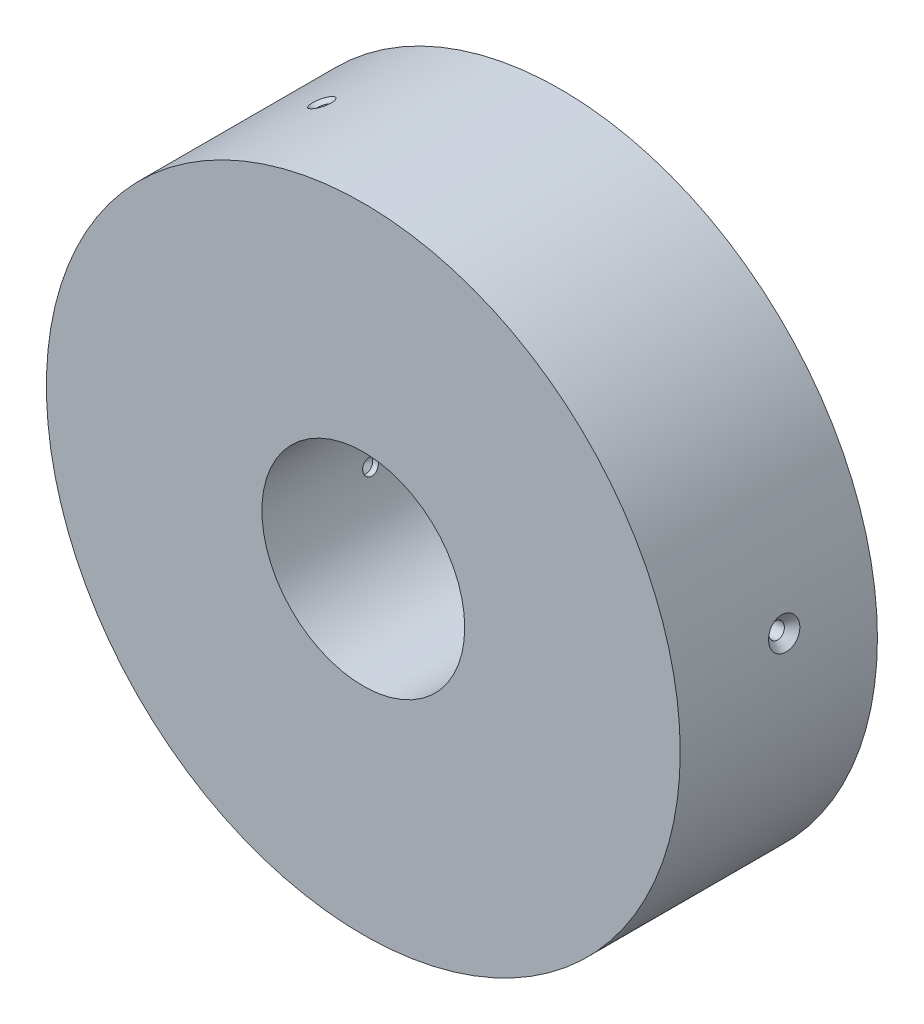
ISO-10303-21;
HEADER;
FILE_DESCRIPTION(('STEP AP214'),'2;1');
FILE_NAME('part.step','',(''),(''),'','','');
FILE_SCHEMA(('AUTOMOTIVE_DESIGN { 1 0 10303 214 1 1 1 1 }'));
ENDSEC;
DATA;
#1=APPLICATION_CONTEXT('core data for automotive mechanical design processes');
#2=APPLICATION_PROTOCOL_DEFINITION('international standard','automotive_design',2000,#1);
#3=PRODUCT_CONTEXT('',#1,'mechanical');
#4=PRODUCT('Part','Part','',(#3));
#5=PRODUCT_RELATED_PRODUCT_CATEGORY('part','',(#4));
#6=PRODUCT_DEFINITION_FORMATION('','',#4);
#7=PRODUCT_DEFINITION_CONTEXT('part definition',#1,'design');
#8=PRODUCT_DEFINITION('design','',#6,#7);
#9=PRODUCT_DEFINITION_SHAPE('','',#8);
#10=(LENGTH_UNIT() NAMED_UNIT(*) SI_UNIT(.MILLI.,.METRE.));
#11=(NAMED_UNIT(*) PLANE_ANGLE_UNIT() SI_UNIT($,.RADIAN.));
#12=(NAMED_UNIT(*) SI_UNIT($,.STERADIAN.) SOLID_ANGLE_UNIT());
#13=UNCERTAINTY_MEASURE_WITH_UNIT(LENGTH_MEASURE(1.E-05),#10,'distance_accuracy_value','');
#14=(GEOMETRIC_REPRESENTATION_CONTEXT(3) GLOBAL_UNCERTAINTY_ASSIGNED_CONTEXT((#13)) GLOBAL_UNIT_ASSIGNED_CONTEXT((#10,
#11,#12)) REPRESENTATION_CONTEXT('',''));
#15=CARTESIAN_POINT('',(0.,0.,0.));
#16=DIRECTION('',(0.,0.,1.));
#17=DIRECTION('',(1.,0.,0.));
#18=AXIS2_PLACEMENT_3D('',#15,#16,#17);
#19=CARTESIAN_POINT('',(0.,0.,28.));
#20=DIRECTION('',(0.,0.,1.));
#21=DIRECTION('',(1.,0.,0.));
#22=AXIS2_PLACEMENT_3D('',#19,#20,#21);
#23=PLANE('',#22);
#24=CARTESIAN_POINT('',(0.,0.,28.));
#25=DIRECTION('',(0.,0.,1.));
#26=DIRECTION('',(1.,0.,0.));
#27=AXIS2_PLACEMENT_3D('',#24,#25,#26);
#28=CIRCLE('',#27,45.);
#29=CARTESIAN_POINT('',(45.,0.,28.));
#30=VERTEX_POINT('',#29);
#31=EDGE_CURVE('E92',#30,#30,#28,.T.);
#32=ORIENTED_EDGE('',*,*,#31,.T.);
#33=EDGE_LOOP('',(#32));
#34=FACE_BOUND('',#33,.T.);
#35=CARTESIAN_POINT('',(0.,0.,28.));
#36=DIRECTION('',(0.,0.,1.));
#37=DIRECTION('',(1.,0.,0.));
#38=AXIS2_PLACEMENT_3D('',#35,#36,#37);
#39=CIRCLE('',#38,14.4);
#40=CARTESIAN_POINT('',(14.4,0.,28.));
#41=VERTEX_POINT('',#40);
#42=EDGE_CURVE('E84',#41,#41,#39,.T.);
#43=ORIENTED_EDGE('',*,*,#42,.F.);
#44=EDGE_LOOP('',(#43));
#45=FACE_BOUND('',#44,.T.);
#46=ADVANCED_FACE('F39',(#34,#45),#23,.T.);
#47=CARTESIAN_POINT('',(0.,0.,0.));
#48=DIRECTION('',(0.,0.,1.));
#49=DIRECTION('',(1.,0.,0.));
#50=AXIS2_PLACEMENT_3D('',#47,#48,#49);
#51=PLANE('',#50);
#52=CARTESIAN_POINT('',(0.,0.,0.));
#53=DIRECTION('',(0.,0.,1.));
#54=DIRECTION('',(1.,0.,0.));
#55=AXIS2_PLACEMENT_3D('',#52,#53,#54);
#56=CIRCLE('',#55,45.);
#57=CARTESIAN_POINT('',(45.,0.,0.));
#58=VERTEX_POINT('',#57);
#59=EDGE_CURVE('E87',#58,#58,#56,.T.);
#60=ORIENTED_EDGE('',*,*,#59,.F.);
#61=EDGE_LOOP('',(#60));
#62=FACE_BOUND('',#61,.T.);
#63=CARTESIAN_POINT('',(0.,0.,0.));
#64=DIRECTION('',(0.,0.,1.));
#65=DIRECTION('',(1.,0.,0.));
#66=AXIS2_PLACEMENT_3D('',#63,#64,#65);
#67=CIRCLE('',#66,14.4);
#68=CARTESIAN_POINT('',(14.4,0.,0.));
#69=VERTEX_POINT('',#68);
#70=EDGE_CURVE('E88',#69,#69,#67,.T.);
#71=ORIENTED_EDGE('',*,*,#70,.T.);
#72=EDGE_LOOP('',(#71));
#73=FACE_BOUND('',#72,.T.);
#74=ADVANCED_FACE('F154',(#62,#73),#51,.F.);
#75=CARTESIAN_POINT('',(0.,0.,28.));
#76=DIRECTION('',(0.,0.,-1.));
#77=DIRECTION('',(-1.,0.,0.));
#78=AXIS2_PLACEMENT_3D('',#75,#76,#77);
#79=CYLINDRICAL_SURFACE('',#78,45.);
#80=CARTESIAN_POINT('',(-21.0428952007584,39.7768344840298,13.0739573904661));
#81=CARTESIAN_POINT('',(-21.0073675603915,39.7956293992141,13.0150345494023));
#82=CARTESIAN_POINT('',(-20.9681229272539,39.8163300383292,12.9589547466294));
#83=CARTESIAN_POINT('',(-20.8828908983348,39.8610986461517,12.8536404169102));
#84=CARTESIAN_POINT('',(-20.836899827359,39.8851684499184,12.8044096497129));
#85=CARTESIAN_POINT('',(-20.730063216627,39.9408152958329,12.7056041034245));
#86=CARTESIAN_POINT('',(-20.6680389385008,39.9729604617733,12.6576099764715));
#87=CARTESIAN_POINT('',(-20.5374270759828,40.0402232677353,12.5742627283755));
#88=CARTESIAN_POINT('',(-20.4688374974114,40.0753418105299,12.5389134635943));
#89=CARTESIAN_POINT('',(-20.3283064002,40.1468063277951,12.4825201498933));
#90=CARTESIAN_POINT('',(-20.2564449054339,40.183119913672,12.4612357697937));
#91=CARTESIAN_POINT('',(-20.1103404843066,40.2564389942479,12.4326849027359));
#92=CARTESIAN_POINT('',(-20.0360979695121,40.2934443689126,12.4254160062924));
#93=CARTESIAN_POINT('',(-19.8883693594883,40.3665637493503,12.4251288745829));
#94=CARTESIAN_POINT('',(-19.8148861899611,40.40268307518,12.4319240962558));
#95=CARTESIAN_POINT('',(-19.6698005215668,40.4735156194476,12.4591710086627));
#96=CARTESIAN_POINT('',(-19.598198008119,40.5082288487878,12.479622593487));
#97=CARTESIAN_POINT('',(-19.4589553713568,40.5753007357521,12.5335189884272));
#98=CARTESIAN_POINT('',(-19.391312764069,40.6076608725789,12.5669555506034));
#99=CARTESIAN_POINT('',(-19.2618246235073,40.6692421817344,12.6457944677526));
#100=CARTESIAN_POINT('',(-19.1999793723322,40.698463201324,12.6911974045988));
#101=CARTESIAN_POINT('',(-19.0830644344662,40.7534155840515,12.7932348148328));
#102=CARTESIAN_POINT('',(-19.0280855650884,40.7791005566159,12.8499982706187));
#103=CARTESIAN_POINT('',(-18.9272681043464,40.8259919795383,12.9727403959067));
#104=CARTESIAN_POINT('',(-18.8814303400093,40.8471980246826,13.0387198982987));
#105=CARTESIAN_POINT('',(-18.7993377657576,40.8850460159915,13.1793331817781));
#106=CARTESIAN_POINT('',(-18.7632770299675,40.9015957462093,13.2541050914273));
#107=CARTESIAN_POINT('',(-18.7028346834685,40.9292692931129,13.4091691891359));
#108=CARTESIAN_POINT('',(-18.6784541668773,40.940392601493,13.4894618935378));
#109=CARTESIAN_POINT('',(-18.6416978552674,40.9571424854365,13.6547332622058));
#110=CARTESIAN_POINT('',(-18.6295301809202,40.9626737777795,13.7397679205013));
#111=CARTESIAN_POINT('',(-18.618243432441,40.9678050494296,13.9108777322749));
#112=CARTESIAN_POINT('',(-18.619125161714,40.9674046635444,13.9969529494904));
#113=CARTESIAN_POINT('',(-18.633978481263,40.9606507812134,14.1684662428191));
#114=CARTESIAN_POINT('',(-18.6480603304991,40.9542471402816,14.2538928350439));
#115=CARTESIAN_POINT('',(-18.6890964820229,40.9355368450566,14.4209263451237));
#116=CARTESIAN_POINT('',(-18.7160508615282,40.9232301553532,14.5025332400626));
#117=CARTESIAN_POINT('',(-18.7820034273548,40.8930024919445,14.6593283942231));
#118=CARTESIAN_POINT('',(-18.8209665558992,40.8750978584467,14.7345345344108));
#119=CARTESIAN_POINT('',(-18.9098837347493,40.8340383281084,14.8765525044979));
#120=CARTESIAN_POINT('',(-18.9598371140983,40.8108837517751,14.943364846449));
#121=CARTESIAN_POINT('',(-19.0685704466118,40.7601908966356,15.0657074930431));
#122=CARTESIAN_POINT('',(-19.1272226039917,40.732715787864,15.1213774934326));
#123=CARTESIAN_POINT('',(-19.252150358331,40.6738179242769,15.2208039730221));
#124=CARTESIAN_POINT('',(-19.3184251152312,40.642395604434,15.2645617632374));
#125=CARTESIAN_POINT('',(-19.4553169064987,40.5770413055386,15.3380406886814));
#126=CARTESIAN_POINT('',(-19.5258273321032,40.543168450801,15.3680130488721));
#127=CARTESIAN_POINT('',(-19.6702313929996,40.4733050618187,15.4141634243488));
#128=CARTESIAN_POINT('',(-19.7441246748539,40.4373147486925,15.4303428772547));
#129=CARTESIAN_POINT('',(-19.891908211763,40.364819497644,15.4482328115978));
#130=CARTESIAN_POINT('',(-19.9657795683864,40.328332028531,15.4501708328572));
#131=CARTESIAN_POINT('',(-20.1125534389851,40.255333955031,15.4401174178891));
#132=CARTESIAN_POINT('',(-20.1854559966416,40.2188233517655,15.4281266118558));
#133=CARTESIAN_POINT('',(-20.3278717205407,40.1470293307381,15.3906944596309));
#134=CARTESIAN_POINT('',(-20.3973998424207,40.1117407445499,15.3653198066324));
#135=CARTESIAN_POINT('',(-20.5315520562122,40.0432397400184,15.3019529873805));
#136=CARTESIAN_POINT('',(-20.5961759999023,40.0100273844312,15.2639604399568));
#137=CARTESIAN_POINT('',(-20.7193415768921,39.9463857906874,15.1761342425421));
#138=CARTESIAN_POINT('',(-20.7778266403223,39.9159827024001,15.12620237465));
#139=CARTESIAN_POINT('',(-20.8865828020978,39.8591825172315,15.0161572924099));
#140=CARTESIAN_POINT('',(-20.9368532128712,39.8327857556954,14.956043226662));
#141=CARTESIAN_POINT('',(-21.0287458256374,39.784351208719,14.8262256523563));
#142=CARTESIAN_POINT('',(-21.0702017365211,39.7623975620406,14.7563730607705));
#143=CARTESIAN_POINT('',(-21.1423328090851,39.7240913983127,14.6098973442908));
#144=CARTESIAN_POINT('',(-21.1730071466454,39.7077393094365,14.5332737023925));
#145=CARTESIAN_POINT('',(-21.2233110317766,39.6808757772779,14.3739378975498));
#146=CARTESIAN_POINT('',(-21.2427302442892,39.6704756053144,14.2911405328254));
#147=CARTESIAN_POINT('',(-21.2691934714466,39.6562937855512,14.1230265310221));
#148=CARTESIAN_POINT('',(-21.2762350520683,39.6525134395203,14.0377094017924));
#149=CARTESIAN_POINT('',(-21.277784387152,39.6516820962966,13.8659252772262));
#150=CARTESIAN_POINT('',(-21.2721437332613,39.6547107787755,13.7794565610967));
#151=CARTESIAN_POINT('',(-21.2481521282238,39.6675713358901,13.6088479464882));
#152=CARTESIAN_POINT('',(-21.2298082347879,39.6773994328799,13.5247067818412));
#153=CARTESIAN_POINT('',(-21.1858157418342,39.7009028900551,13.3776411467995));
#154=CARTESIAN_POINT('',(-21.1623800534905,39.7134059975382,13.31385456433));
#155=CARTESIAN_POINT('',(-21.1080824490219,39.7422923495488,13.1904809497549));
#156=CARTESIAN_POINT('',(-21.0772240129307,39.7586737757335,13.1308919665496));
#157=CARTESIAN_POINT('',(-21.0428952007584,39.7768344840298,13.0739573904661));
#158=B_SPLINE_CURVE_WITH_KNOTS('',3,(#80,#81,#82,#83,#84,#85,#86,#87,#88,#89,#90,#91,#92,#93,
#94,#95,#96,#97,#98,#99,#100,#101,#102,#103,#104,#105,#106,#107,#108,#109,#110,#111,#112,#113,
#114,#115,#116,#117,#118,#119,#120,#121,#122,#123,#124,#125,#126,#127,#128,#129,#130,#131,#132,
#133,#134,#135,#136,#137,#138,#139,#140,#141,#142,#143,#144,#145,#146,#147,#148,#149,#150,#151,
#152,#153,#154,#155,#156,#157),.UNSPECIFIED.,.T.,.F.,(4,2,2,2,2,2,2,2,2,2,2,2,2,2,2,2,2,2,2,2,2,
2,2,2,2,2,2,2,2,2,2,2,2,2,2,2,2,2,4),(0.,0.213800423053472,0.427717751716027,0.680720383458717,
0.933800108925164,1.1824351410236,1.43102742497892,1.67634358012602,1.92165783278667,
2.16681651825732,2.4119871269388,2.66011772557381,2.90827076326158,3.16103885695427,
3.41383062349065,3.67086062141034,3.92790644381228,4.18711865316305,4.44633241745436,
4.70479650047774,4.96324480860145,5.21821592794319,5.47315897471813,5.72325140525248,
5.97331776573463,6.21937986995408,6.46543084180264,6.71026713955823,6.95511083417499,
7.20204255700417,7.44899493760496,7.70025835592236,7.95154097609318,8.20737956629233,
8.46326846073602,8.72216734853946,8.98092251165874,9.18760526414537,9.39419130502986),.UNSPECIFIED.);
#159=CARTESIAN_POINT('',(-21.0428952007584,39.7768344840298,13.0739573904661));
#160=VERTEX_POINT('',#159);
#161=EDGE_CURVE('E11',#160,#160,#158,.T.);
#162=ORIENTED_EDGE('',*,*,#161,.T.);
#163=EDGE_LOOP('',(#162));
#164=FACE_BOUND('',#163,.T.);
#165=CARTESIAN_POINT('',(44.6683095181971,5.45363410563512,10.9446865556204));
#166=CARTESIAN_POINT('',(44.678919985219,5.36672831389895,11.0080949755624));
#167=CARTESIAN_POINT('',(44.6886989157546,5.28451710318225,11.0781314435854));
#168=CARTESIAN_POINT('',(44.7065565179975,5.13125487871574,11.2297675331237));
#169=CARTESIAN_POINT('',(44.7146336707229,5.06021384953215,11.3113773770877));
#170=CARTESIAN_POINT('',(44.7300177509489,4.92249143017027,11.495366302312));
#171=CARTESIAN_POINT('',(44.7370927252407,4.85754018025439,11.599066695091));
#172=CARTESIAN_POINT('',(44.749122178129,4.74544593277191,11.8157972811994));
#173=CARTESIAN_POINT('',(44.7540761343265,4.69830732272904,11.9288297648214));
#174=CARTESIAN_POINT('',(44.7619978801435,4.6222341886963,12.1634648641946));
#175=CARTESIAN_POINT('',(44.7649235608263,4.59368631779518,12.2851944143077));
#176=CARTESIAN_POINT('',(44.7686683996791,4.55704647604928,12.5317225481176));
#177=CARTESIAN_POINT('',(44.7694874636425,4.54895542002034,12.6565212688136));
#178=CARTESIAN_POINT('',(44.7690298260289,4.55345753563445,12.9073133979216));
#179=CARTESIAN_POINT('',(44.7677267302293,4.56631120707755,13.0333021770648));
#180=CARTESIAN_POINT('',(44.7629526520789,4.61287445176097,13.2813299609912));
#181=CARTESIAN_POINT('',(44.7594815965282,4.6465847292127,13.4033688322616));
#182=CARTESIAN_POINT('',(44.7503217197811,4.73398616396516,13.6399509641334));
#183=CARTESIAN_POINT('',(44.7446335110188,4.78767180337657,13.7544962844491));
#184=CARTESIAN_POINT('',(44.7309777732128,4.91361601475564,13.9727347157523));
#185=CARTESIAN_POINT('',(44.7230103666719,4.98587358849476,14.0764284095857));
#186=CARTESIAN_POINT('',(44.7048753267458,5.14592102351171,14.2684894004899));
#187=CARTESIAN_POINT('',(44.6947382816132,5.23349213238912,14.3570417577956));
#188=CARTESIAN_POINT('',(44.6722162420976,5.4223719421213,14.5176871572273));
#189=CARTESIAN_POINT('',(44.6598315296362,5.52367891970339,14.5897822610052));
#190=CARTESIAN_POINT('',(44.6332172894481,5.73471523488019,14.7137445726366));
#191=CARTESIAN_POINT('',(44.6190348898989,5.84420729241788,14.7660258031448));
#192=CARTESIAN_POINT('',(44.5888312992805,6.07034725163461,14.8508571323552));
#193=CARTESIAN_POINT('',(44.572810365889,6.18699414947031,14.8834099920594));
#194=CARTESIAN_POINT('',(44.5396384234174,6.42139502340531,14.9271999384894));
#195=CARTESIAN_POINT('',(44.5225194240693,6.5390702406662,14.9388836268894));
#196=CARTESIAN_POINT('',(44.4873002625024,6.77453180253228,14.9419232747287));
#197=CARTESIAN_POINT('',(44.4692001745258,6.89231813806783,14.9332807702247));
#198=CARTESIAN_POINT('',(44.4327580081589,7.12345270857752,14.8961440676452));
#199=CARTESIAN_POINT('',(44.4144200594689,7.23683319541193,14.8678459118957));
#200=CARTESIAN_POINT('',(44.3779490008403,7.45721990987268,14.7925201022161));
#201=CARTESIAN_POINT('',(44.3598158948298,7.5642260154333,14.7454920897525));
#202=CARTESIAN_POINT('',(44.3242842764993,7.76973555934499,14.6337691391622));
#203=CARTESIAN_POINT('',(44.3068920437518,7.86817172233027,14.5689485767198));
#204=CARTESIAN_POINT('',(44.2736520822218,8.05310970714816,14.4237608260943));
#205=CARTESIAN_POINT('',(44.2578044938973,8.13961044396159,14.3433922260719));
#206=CARTESIAN_POINT('',(44.2279853679666,8.30012786787362,14.1676910521538));
#207=CARTESIAN_POINT('',(44.2140577235526,8.37386006315275,14.0720911911054));
#208=CARTESIAN_POINT('',(44.1890434710385,8.50487505512671,13.8698851909573));
#209=CARTESIAN_POINT('',(44.1779571921221,8.56215594596454,13.763277778594));
#210=CARTESIAN_POINT('',(44.1588793506284,8.66001904714677,13.5394851598203));
#211=CARTESIAN_POINT('',(44.1509637070989,8.70019291536927,13.422114840865));
#212=CARTESIAN_POINT('',(44.1389438237131,8.76097051139951,13.1822239366686));
#213=CARTESIAN_POINT('',(44.1348399511339,8.78157235338081,13.0597028563229));
#214=CARTESIAN_POINT('',(44.1305929757169,8.80289097219691,12.8109020186797));
#215=CARTESIAN_POINT('',(44.1305139919548,8.80328583930182,12.684593476594));
#216=CARTESIAN_POINT('',(44.1344830335227,8.78336535155308,12.4336809592882));
#217=CARTESIAN_POINT('',(44.1385312441387,8.76304906689386,12.3090770608509));
#218=CARTESIAN_POINT('',(44.1505935063921,8.70207191017277,12.0646212239453));
#219=CARTESIAN_POINT('',(44.1586230653918,8.66133147908566,11.944789862058));
#220=CARTESIAN_POINT('',(44.1782863395452,8.56046972756208,11.7138915057035));
#221=CARTESIAN_POINT('',(44.1899199644735,8.50034889229962,11.6028242919189));
#222=CARTESIAN_POINT('',(44.2161343653791,8.3629117232996,11.3937809327906));
#223=CARTESIAN_POINT('',(44.2306864897891,8.28576187875346,11.2956918220479));
#224=CARTESIAN_POINT('',(44.2621551317115,8.115975278291,11.1144208277378));
#225=CARTESIAN_POINT('',(44.2790714006325,8.02334015046214,11.0312373789259));
#226=CARTESIAN_POINT('',(44.3141679834755,7.82714691584688,10.8839671023176));
#227=CARTESIAN_POINT('',(44.332315910075,7.72384688380111,10.819528860222));
#228=CARTESIAN_POINT('',(44.369426235607,7.5077301959708,10.7096484863998));
#229=CARTESIAN_POINT('',(44.3883884956879,7.3949151594473,10.6642031302765));
#230=CARTESIAN_POINT('',(44.425950039391,7.16576058766954,10.5946596416328));
#231=CARTESIAN_POINT('',(44.4445475419082,7.04956347306289,10.5700908662365));
#232=CARTESIAN_POINT('',(44.4811845880677,6.81456885271699,10.5413589357091));
#233=CARTESIAN_POINT('',(44.4992240980686,6.69577119092482,10.5371970085369));
#234=CARTESIAN_POINT('',(44.5339453618073,6.46077617008035,10.549330259494));
#235=CARTESIAN_POINT('',(44.5506427924107,6.34456587261612,10.5653349621477));
#236=CARTESIAN_POINT('',(44.5825421046523,6.11638714598839,10.616781410688));
#237=CARTESIAN_POINT('',(44.5977451647775,6.00441541776998,10.6522076929668));
#238=CARTESIAN_POINT('',(44.6224041064183,5.81784540054067,10.7289487813226));
#239=CARTESIAN_POINT('',(44.6322859561934,5.74148139615684,10.7659191624317));
#240=CARTESIAN_POINT('',(44.6510539841594,5.59365023519201,10.848782218011));
#241=CARTESIAN_POINT('',(44.6599404175078,5.52218182554495,10.8946725977095));
#242=CARTESIAN_POINT('',(44.6683095181971,5.45363410563512,10.9446865556204));
#243=B_SPLINE_CURVE_WITH_KNOTS('',3,(#165,#166,#167,#168,#169,#170,#171,#172,#173,#174,#175,
#176,#177,#178,#179,#180,#181,#182,#183,#184,#185,#186,#187,#188,#189,#190,#191,#192,#193,#194,
#195,#196,#197,#198,#199,#200,#201,#202,#203,#204,#205,#206,#207,#208,#209,#210,#211,#212,#213,
#214,#215,#216,#217,#218,#219,#220,#221,#222,#223,#224,#225,#226,#227,#228,#229,#230,#231,#232,
#233,#234,#235,#236,#237,#238,#239,#240,#241,#242),.UNSPECIFIED.,.T.,.F.,(4,2,2,2,2,2,2,2,2,2,2,
2,2,2,2,2,2,2,2,2,2,2,2,2,2,2,2,2,2,2,2,2,2,2,2,2,2,2,4),(0.,0.324054949497402,0.64839793162072,
1.01437421662824,1.38044058848348,1.75389596870395,2.12736804931785,2.5055207386365,
2.88368619676201,3.26174726990263,3.63978802677149,4.0128140264795,4.38579327037297,
4.75048153679936,5.11511875300335,5.4718547325642,5.82856375434584,6.18176516728002,
6.53497334164413,6.89074250432336,7.24654398779291,7.6094661987063,7.97243043662712,
8.34362955803142,8.71486444201497,9.0920115184788,9.46917552731318,9.84782026933397,
10.2264555330012,10.6015411461344,10.9765873483939,11.3440670368536,11.7114843134128,
12.0703804158724,12.4292981142289,12.7831046438247,13.136629878269,13.392296802164,
13.6478980396624),.UNSPECIFIED.);
#244=CARTESIAN_POINT('',(44.6683095181971,5.45363410563512,10.9446865556204));
#245=VERTEX_POINT('',#244);
#246=EDGE_CURVE('E54',#245,#245,#243,.T.);
#247=ORIENTED_EDGE('',*,*,#246,.T.);
#248=EDGE_LOOP('',(#247));
#249=FACE_BOUND('',#248,.T.);
#250=ORIENTED_EDGE('',*,*,#31,.F.);
#251=EDGE_LOOP('',(#250));
#252=FACE_BOUND('',#251,.T.);
#253=ORIENTED_EDGE('',*,*,#59,.T.);
#254=EDGE_LOOP('',(#253));
#255=FACE_BOUND('',#254,.T.);
#256=ADVANCED_FACE('F41',(#164,#249,#252,#255),#79,.T.);
#257=CARTESIAN_POINT('',(0.,0.,28.));
#258=DIRECTION('',(0.,0.,-1.));
#259=DIRECTION('',(-1.,0.,0.));
#260=AXIS2_PLACEMENT_3D('',#257,#258,#259);
#261=CYLINDRICAL_SURFACE('',#260,14.4);
#262=CARTESIAN_POINT('',(5.57808165500605,-13.2757299253218,13.9365692920702));
#263=CARTESIAN_POINT('',(5.57808378573651,-13.2757292809626,13.9864537349427));
#264=CARTESIAN_POINT('',(5.58197387015151,-13.27409660665,14.0363731372226));
#265=CARTESIAN_POINT('',(5.59742680891836,-13.2675875990363,14.134833630108));
#266=CARTESIAN_POINT('',(5.60899860145459,-13.2627074871067,14.1833730463144));
#267=CARTESIAN_POINT('',(5.63945281558359,-13.2497865623058,14.2776330963139));
#268=CARTESIAN_POINT('',(5.65833138714674,-13.2417474139347,14.3233551999));
#269=CARTESIAN_POINT('',(5.70281341091032,-13.2226511033036,14.410699815769));
#270=CARTESIAN_POINT('',(5.72841532002875,-13.2115946335302,14.4523232657291));
#271=CARTESIAN_POINT('',(5.78560453938405,-13.1866505102511,14.5303622074199));
#272=CARTESIAN_POINT('',(5.81719956317269,-13.1727592063513,14.5667708801983));
#273=CARTESIAN_POINT('',(5.8854033203209,-13.1424281529159,14.6332884174145));
#274=CARTESIAN_POINT('',(5.92201226239491,-13.125988297288,14.6633970194673));
#275=CARTESIAN_POINT('',(5.99918321489135,-13.0908974519603,14.7164804403669));
#276=CARTESIAN_POINT('',(6.03974829585345,-13.0722447422942,14.7394496591834));
#277=CARTESIAN_POINT('',(6.12360957195899,-13.0331708908664,14.7775664360334));
#278=CARTESIAN_POINT('',(6.16690573844259,-13.0127497676616,14.7927140761307));
#279=CARTESIAN_POINT('',(6.2549074710164,-12.9706787319903,14.8147389043864));
#280=CARTESIAN_POINT('',(6.29961115136512,-12.9490304349099,14.8216267122285));
#281=CARTESIAN_POINT('',(6.3891928554852,-12.905065040967,14.8269691497471));
#282=CARTESIAN_POINT('',(6.43407087732595,-12.8827479514922,14.8254238725442));
#283=CARTESIAN_POINT('',(6.52266670366456,-12.8381181159596,14.8139527693505));
#284=CARTESIAN_POINT('',(6.56638600602329,-12.8158054054339,14.8040383677683));
#285=CARTESIAN_POINT('',(6.65151160004669,-12.771831900026,14.7761281764498));
#286=CARTESIAN_POINT('',(6.6929178783026,-12.7501711089234,14.7581323398703));
#287=CARTESIAN_POINT('',(6.7723135385823,-12.7081780695663,14.7145571721511));
#288=CARTESIAN_POINT('',(6.81030056385318,-12.6878467402568,14.6889726618337));
#289=CARTESIAN_POINT('',(6.8818059959802,-12.6492055341383,14.630950166542));
#290=CARTESIAN_POINT('',(6.91532435380669,-12.6308956795092,14.5985121063816));
#291=CARTESIAN_POINT('',(6.97705701226134,-12.5969012911564,14.5276387820128));
#292=CARTESIAN_POINT('',(7.00526237003939,-12.5812211886139,14.489193602079));
#293=CARTESIAN_POINT('',(7.05555829132307,-12.5530844976678,14.4074321025557));
#294=CARTESIAN_POINT('',(7.07764885245776,-12.540627910514,14.3641157810775));
#295=CARTESIAN_POINT('',(7.11513868567546,-12.5193956708331,14.273835268541));
#296=CARTESIAN_POINT('',(7.13053759174852,-12.5106202196519,14.2268708781119));
#297=CARTESIAN_POINT('',(7.15423985760261,-12.4970812586171,14.130630271159));
#298=CARTESIAN_POINT('',(7.16254329881656,-12.4923177027198,14.081354081174));
#299=CARTESIAN_POINT('',(7.17183016767697,-12.4869884790206,13.981975696368));
#300=CARTESIAN_POINT('',(7.17282565142746,-12.4864158972776,13.9318749987025));
#301=CARTESIAN_POINT('',(7.16750252579795,-12.4894722305464,13.8321932537999));
#302=CARTESIAN_POINT('',(7.16118395353792,-12.493101124235,13.7826122039269));
#303=CARTESIAN_POINT('',(7.14140523807917,-12.5044176009924,13.6854163899361));
#304=CARTESIAN_POINT('',(7.12795065609606,-12.5121020234945,13.6378001257288));
#305=CARTESIAN_POINT('',(7.09425312378059,-12.5312388009009,13.5458392400499));
#306=CARTESIAN_POINT('',(7.07401011338159,-12.5426911891455,13.5014946475317));
#307=CARTESIAN_POINT('',(7.02723141119685,-12.5689592436635,13.4172721597145));
#308=CARTESIAN_POINT('',(7.00068751607378,-12.583779293327,13.3774001879695));
#309=CARTESIAN_POINT('',(6.94201577635635,-12.6162410420052,13.3033144270551));
#310=CARTESIAN_POINT('',(6.90988787836752,-12.6338827680007,13.2691006919962));
#311=CARTESIAN_POINT('',(6.84084934683661,-12.6713978223864,13.2072557675287));
#312=CARTESIAN_POINT('',(6.80393229628847,-12.6912741400617,13.1796335537291));
#313=CARTESIAN_POINT('',(6.72634040956143,-12.7325674364233,13.1318171813846));
#314=CARTESIAN_POINT('',(6.68566559610497,-12.7539844057934,13.1116229779276));
#315=CARTESIAN_POINT('',(6.60169889307884,-12.7976485153203,13.0792514829723));
#316=CARTESIAN_POINT('',(6.55840888313539,-12.8198950549385,13.0670685066661));
#317=CARTESIAN_POINT('',(6.47038925730785,-12.8645441839413,13.0510466908708));
#318=CARTESIAN_POINT('',(6.42565965518351,-12.8869467718329,13.0472077716524));
#319=CARTESIAN_POINT('',(6.33610127233114,-12.9312146273724,13.0479838149953));
#320=CARTESIAN_POINT('',(6.2912727802651,-12.9530807266749,13.0525847285108));
#321=CARTESIAN_POINT('',(6.20272608486554,-12.9957148592135,13.0700807116125));
#322=CARTESIAN_POINT('',(6.15900788349486,-13.0164828905084,13.0829757958605));
#323=CARTESIAN_POINT('',(6.07394979965289,-13.0563908736606,13.1166909261259));
#324=CARTESIAN_POINT('',(6.03260990302935,-13.0755308352063,13.1375109249799));
#325=CARTESIAN_POINT('',(5.95352032347102,-13.1117309955871,13.1864828976383));
#326=CARTESIAN_POINT('',(5.91577054629778,-13.1287912490167,13.2146346789153));
#327=CARTESIAN_POINT('',(5.8449219273615,-13.1604862715342,13.2775229063043));
#328=CARTESIAN_POINT('',(5.81183038132069,-13.1751172421725,13.3122694856681));
#329=CARTESIAN_POINT('',(5.7513534300773,-13.2016297169513,13.3873478123358));
#330=CARTESIAN_POINT('',(5.72396942383897,-13.2135105470888,13.4276809249213));
#331=CARTESIAN_POINT('',(5.67572103501612,-13.2343070840311,13.5128325388798));
#332=CARTESIAN_POINT('',(5.65486466034574,-13.2432191496945,13.5576564611971));
#333=CARTESIAN_POINT('',(5.62037885530093,-13.2578918397634,13.6504453633015));
#334=CARTESIAN_POINT('',(5.60674095570135,-13.2636561575821,13.6984065875843));
#335=CARTESIAN_POINT('',(5.59066011592844,-13.2704394169435,13.7783128385932));
#336=CARTESIAN_POINT('',(5.58594972940653,-13.272421687292,13.8097412765341));
#337=CARTESIAN_POINT('',(5.57965982172439,-13.275067146029,13.8729648357134));
#338=CARTESIAN_POINT('',(5.57808029632353,-13.2757303362042,13.9047599564549));
#339=CARTESIAN_POINT('',(5.57808165500605,-13.2757299253218,13.9365692920702));
#340=B_SPLINE_CURVE_WITH_KNOTS('',3,(#262,#263,#264,#265,#266,#267,#268,#269,#270,#271,#272,
#273,#274,#275,#276,#277,#278,#279,#280,#281,#282,#283,#284,#285,#286,#287,#288,#289,#290,#291,
#292,#293,#294,#295,#296,#297,#298,#299,#300,#301,#302,#303,#304,#305,#306,#307,#308,#309,#310,
#311,#312,#313,#314,#315,#316,#317,#318,#319,#320,#321,#322,#323,#324,#325,#326,#327,#328,#329,
#330,#331,#332,#333,#334,#335,#336,#337,#338,#339),.UNSPECIFIED.,.T.,.F.,(4,2,2,2,2,2,2,2,2,2,2,
2,2,2,2,2,2,2,2,2,2,2,2,2,2,2,2,2,2,2,2,2,2,2,2,2,2,2,4),(0.,0.14953720520358,0.299248712708336,
0.448881442579441,0.598479860015463,0.748272143688428,0.898070664662723,1.04798639065869,
1.1979005437104,1.34762174445644,1.49734129193931,1.64685679221715,1.79637315915641,
1.94599180492014,2.09561209214571,2.24548201306234,2.39535199208898,2.54523016744353,
2.69510662265945,2.84473576758919,2.99436415313116,3.14387610165898,3.29338937316166,
3.44309837918411,3.59280881680932,3.7427219650045,3.89263420676443,4.04243995489982,
4.19224427160268,4.34179944851571,4.49135488980329,4.6409094410598,4.79046006551578,
4.94024237043798,5.09006134515398,5.24006339961068,5.38988906873465,5.48524315742686,
5.58059711696561),.UNSPECIFIED.);
#341=CARTESIAN_POINT('',(5.57808165500605,-13.2757299253218,13.9365692920702));
#342=VERTEX_POINT('',#341);
#343=EDGE_CURVE('E44',#342,#342,#340,.T.);
#344=ORIENTED_EDGE('',*,*,#343,.F.);
#345=EDGE_LOOP('',(#344));
#346=FACE_BOUND('',#345,.T.);
#347=CARTESIAN_POINT('',(-7.17161878459045,12.4871087129291,13.9365692920702));
#348=CARTESIAN_POINT('',(-7.17161697992164,12.4871100161488,13.8866848491976));
#349=CARTESIAN_POINT('',(-7.16795943227388,12.4892125687334,13.8367654469178));
#350=CARTESIAN_POINT('',(-7.15341162758659,12.4975505466315,13.7383049540324));
#351=CARTESIAN_POINT('',(-7.14251294498641,12.5037907864127,13.6897655378259));
#352=CARTESIAN_POINT('',(-7.11376847860637,12.5201665339819,13.5955054878264));
#353=CARTESIAN_POINT('',(-7.09592635338276,12.5302999903667,13.5497833842403));
#354=CARTESIAN_POINT('',(-7.05376372415615,12.5540830140291,13.4624387683713));
#355=CARTESIAN_POINT('',(-7.02944470665505,12.5677317744907,13.4208153184112));
#356=CARTESIAN_POINT('',(-6.97492535513562,12.5980707989729,13.3427763767204));
#357=CARTESIAN_POINT('',(-6.94471744029544,12.6147649815899,13.306367703942));
#358=CARTESIAN_POINT('',(-6.87923445373255,12.6505937934937,13.2398501667258));
#359=CARTESIAN_POINT('',(-6.84395917106748,12.6697285243709,13.2097415646731));
#360=CARTESIAN_POINT('',(-6.76925294870274,12.7097997568827,13.1566581437734));
#361=CARTESIAN_POINT('',(-6.72981877913799,12.7307376565407,13.133688924957));
#362=CARTESIAN_POINT('',(-6.64788791633024,12.7737122212858,13.0955721481069));
#363=CARTESIAN_POINT('',(-6.60539125522416,12.795748874842,13.0804245080096));
#364=CARTESIAN_POINT('',(-6.51856612441908,12.8401974253147,13.058399679754));
#365=CARTESIAN_POINT('',(-6.47424008281351,12.8626088027553,13.0515118719118));
#366=CARTESIAN_POINT('',(-6.38495052123511,12.9071645181098,13.0461694343932));
#367=CARTESIAN_POINT('',(-6.33998700830691,12.9293088589696,13.0477147115961));
#368=CARTESIAN_POINT('',(-6.25076715098528,12.9726777386393,13.0591858147898));
#369=CARTESIAN_POINT('',(-6.20650992633316,12.9939034898823,13.069100216372));
#370=CARTESIAN_POINT('',(-6.11991671339286,13.0349114331173,13.0970104076905));
#371=CARTESIAN_POINT('',(-6.07758073624254,13.0546936167411,13.11500624427));
#372=CARTESIAN_POINT('',(-5.99603752201721,13.0923471748664,13.1585814119892));
#373=CARTESIAN_POINT('',(-5.95683244501278,13.1102172329945,13.1841659223066));
#374=CARTESIAN_POINT('',(-5.88273984120163,13.1436306389035,13.2421884175983));
#375=CARTESIAN_POINT('',(-5.84785236176734,13.1591739611561,13.2746264777587));
#376=CARTESIAN_POINT('',(-5.78338178655419,13.1876359444153,13.3454998021275));
#377=CARTESIAN_POINT('',(-5.75380763798136,13.2005501830426,13.3839449820613));
#378=CARTESIAN_POINT('',(-5.70093106336387,13.2234722451638,13.4657064815846));
#379=CARTESIAN_POINT('',(-5.677628639751,13.233480067531,13.5090228030628));
#380=CARTESIAN_POINT('',(-5.63800885513718,13.2504083947878,13.5993033155993));
#381=CARTESIAN_POINT('',(-5.62169187621615,13.2573287308035,13.6462677060284));
#382=CARTESIAN_POINT('',(-5.59655134664835,13.2679614466171,13.7425083129813));
#383=CARTESIAN_POINT('',(-5.58772771000231,13.2716738632315,13.7917845029663));
#384=CARTESIAN_POINT('',(-5.57785785068641,13.2758250601132,13.8911628877723));
#385=CARTESIAN_POINT('',(-5.57679881857507,13.2762692320811,13.9412635854379));
#386=CARTESIAN_POINT('',(-5.58245744644413,13.2738908355294,14.0409453303404));
#387=CARTESIAN_POINT('',(-5.5891750669568,13.2710682835889,14.0905263802134));
#388=CARTESIAN_POINT('',(-5.6101688191975,13.2622069858141,14.1877221942042));
#389=CARTESIAN_POINT('',(-5.62443906501595,13.2561707444495,14.2353384584115));
#390=CARTESIAN_POINT('',(-5.66009266950387,13.2409865282804,14.3272993440904));
#391=CARTESIAN_POINT('',(-5.68147609111349,13.2318385259418,14.3716439366087));
#392=CARTESIAN_POINT('',(-5.73073367202627,13.2105794481427,14.4558664244258));
#393=CARTESIAN_POINT('',(-5.75861629199666,13.1984645092688,14.4957383961708));
#394=CARTESIAN_POINT('',(-5.82001177263592,13.1715065211059,14.5698241570852));
#395=CARTESIAN_POINT('',(-5.85352468714182,13.1566634457303,14.6040378921442));
#396=CARTESIAN_POINT('',(-5.92522567086749,13.1245283080416,14.6658828166117));
#397=CARTESIAN_POINT('',(-5.96342000888776,13.1072329569698,14.6935050304112));
#398=CARTESIAN_POINT('',(-6.04331283278028,13.0705890775252,14.7413214027557));
#399=CARTESIAN_POINT('',(-6.08501129746364,13.0512405615674,14.7615156062128));
#400=CARTESIAN_POINT('',(-6.17065561288807,13.0109663401183,14.793887101168));
#401=CARTESIAN_POINT('',(-6.21459984610423,12.9900417647838,14.8060700774742));
#402=CARTESIAN_POINT('',(-6.30348555559984,12.947142698372,14.8220918932695));
#403=CARTESIAN_POINT('',(-6.34842702234637,12.925168217329,14.8259308124879));
#404=CARTESIAN_POINT('',(-6.43794291227975,12.8808144979513,14.825154769145));
#405=CARTESIAN_POINT('',(-6.48251782159341,12.8584359935486,14.8205538556295));
#406=CARTESIAN_POINT('',(-6.57012118569564,12.813895707049,14.8030578725278));
#407=CARTESIAN_POINT('',(-6.61314963775035,12.7917339253352,14.7901627882798));
#408=CARTESIAN_POINT('',(-6.69646958980547,12.7483137648601,14.7564476580145));
#409=CARTESIAN_POINT('',(-6.73676110609244,12.7270553807233,14.7356276591604));
#410=CARTESIAN_POINT('',(-6.81351301402119,12.6861315754798,14.686655686502));
#411=CARTESIAN_POINT('',(-6.84997350622766,12.666466112562,14.658503905225));
#412=CARTESIAN_POINT('',(-6.9181451308566,12.6293617886493,14.595615677836));
#413=CARTESIAN_POINT('',(-6.94984881817424,12.6119264242524,14.5608690984722));
#414=CARTESIAN_POINT('',(-7.00760922780177,12.5799247363242,14.4857907718045));
#415=CARTESIAN_POINT('',(-7.03366456571806,12.5653591162383,14.445457659219));
#416=CARTESIAN_POINT('',(-7.07946340971684,12.5396128764902,14.3603060452605));
#417=CARTESIAN_POINT('',(-7.09919916379222,12.5284364150709,14.3154821229432));
#418=CARTESIAN_POINT('',(-7.13178169066245,12.5099178426044,14.2226932208388));
#419=CARTESIAN_POINT('',(-7.14463653682594,12.5025712382516,14.174731996556));
#420=CARTESIAN_POINT('',(-7.15978323219294,12.493900388534,14.0948257455471));
#421=CARTESIAN_POINT('',(-7.16421627184172,12.4913576938232,14.0633973076062));
#422=CARTESIAN_POINT('',(-7.17013462142713,12.4879614416588,14.000173748427));
#423=CARTESIAN_POINT('',(-7.17161993535635,12.4871078819174,13.9683786276854));
#424=CARTESIAN_POINT('',(-7.17161878459045,12.4871087129291,13.9365692920702));
#425=B_SPLINE_CURVE_WITH_KNOTS('',3,(#347,#348,#349,#350,#351,#352,#353,#354,#355,#356,#357,
#358,#359,#360,#361,#362,#363,#364,#365,#366,#367,#368,#369,#370,#371,#372,#373,#374,#375,#376,
#377,#378,#379,#380,#381,#382,#383,#384,#385,#386,#387,#388,#389,#390,#391,#392,#393,#394,#395,
#396,#397,#398,#399,#400,#401,#402,#403,#404,#405,#406,#407,#408,#409,#410,#411,#412,#413,#414,
#415,#416,#417,#418,#419,#420,#421,#422,#423,#424),.UNSPECIFIED.,.T.,.F.,(4,2,2,2,2,2,2,2,2,2,2,
2,2,2,2,2,2,2,2,2,2,2,2,2,2,2,2,2,2,2,2,2,2,2,2,2,2,2,4),(0.,0.149537205203579,
0.299248712708335,0.44888144257944,0.598479860015463,0.748272143688422,0.898070664662716,
1.04798639065869,1.1979005437104,1.34762174445644,1.49734129193931,1.64685679221715,
1.79637315915641,1.94599180492014,2.0956120921457,2.24548201306234,2.39535199208898,
2.54523016744353,2.69510662265945,2.84473576758918,2.99436415313115,3.14387610165898,
3.29338937316166,3.44309837918411,3.59280881680932,3.7427219650045,3.89263420676443,
4.04243995489981,4.19224427160267,4.34179944851571,4.49135488980329,4.6409094410598,
4.79046006551578,4.94024237043798,5.09006134515397,5.24006339961067,5.38988906873465,
5.48524315742686,5.58059711696561),.UNSPECIFIED.);
#426=CARTESIAN_POINT('',(-7.17161878459045,12.4871087129291,13.9365692920702));
#427=VERTEX_POINT('',#426);
#428=EDGE_CURVE('E70',#427,#427,#425,.T.);
#429=ORIENTED_EDGE('',*,*,#428,.F.);
#430=EDGE_LOOP('',(#429));
#431=FACE_BOUND('',#430,.T.);
#432=CARTESIAN_POINT('',(-14.3620611628125,-1.04460478442023,12.7405745471577));
#433=CARTESIAN_POINT('',(-14.3620613147407,-1.04460753992737,12.8022652420436));
#434=CARTESIAN_POINT('',(-14.3616852314089,-1.04981382151018,12.8639983726357));
#435=CARTESIAN_POINT('',(-14.3601577039238,-1.07050182134588,12.985757826979));
#436=CARTESIAN_POINT('',(-14.3590053724603,-1.0859952983487,13.0457821154667));
#437=CARTESIAN_POINT('',(-14.3558612632288,-1.12679346183536,13.1623426978032));
#438=CARTESIAN_POINT('',(-14.353869949336,-1.15209272606064,13.2188808993446));
#439=CARTESIAN_POINT('',(-14.3489563091129,-1.21175261145402,13.3268917645085));
#440=CARTESIAN_POINT('',(-14.3460341869464,-1.24611124525209,13.3783655357274));
#441=CARTESIAN_POINT('',(-14.3391506907539,-1.32296806856335,13.4749124718182));
#442=CARTESIAN_POINT('',(-14.3351873227532,-1.3654818324501,13.5199730975433));
#443=CARTESIAN_POINT('',(-14.3261360340047,-1.45737902888069,13.6023070350926));
#444=CARTESIAN_POINT('',(-14.3210480649667,-1.50676275638553,13.6395800123831));
#445=CARTESIAN_POINT('',(-14.3096922375075,-1.6110425175416,13.7053214126485));
#446=CARTESIAN_POINT('',(-14.3034229583555,-1.66594515115434,13.733779123626));
#447=CARTESIAN_POINT('',(-14.2897229594151,-1.77963267062552,13.7810136497161));
#448=CARTESIAN_POINT('',(-14.2822922570703,-1.83841749816905,13.7997906102072));
#449=CARTESIAN_POINT('',(-14.2663811433932,-1.95806075086004,13.8270949087086));
#450=CARTESIAN_POINT('',(-14.2579028273813,-2.01891486596733,13.8356423519848));
#451=CARTESIAN_POINT('',(-14.2400721080626,-2.14106404970599,13.8423071153246));
#452=CARTESIAN_POINT('',(-14.2307197186789,-2.20235911129919,13.8404246014987));
#453=CARTESIAN_POINT('',(-14.211439852582,-2.32351748159222,13.8262993795781));
#454=CARTESIAN_POINT('',(-14.2015136163351,-2.3833835104742,13.8140782933739));
#455=CARTESIAN_POINT('',(-14.1814261747265,-2.50013251975082,13.7796564346442));
#456=CARTESIAN_POINT('',(-14.1712649674347,-2.55701547563111,13.7574555801212));
#457=CARTESIAN_POINT('',(-14.1511161702174,-2.66627148799267,13.7036801461257));
#458=CARTESIAN_POINT('',(-14.1411287718621,-2.71863979222712,13.6720958411314));
#459=CARTESIAN_POINT('',(-14.121793234357,-2.81735512036892,13.60045713334));
#460=CARTESIAN_POINT('',(-14.1124451060725,-2.86370204194621,13.5604025866262));
#461=CARTESIAN_POINT('',(-14.094823928556,-2.94921234272802,13.4728384416767));
#462=CARTESIAN_POINT('',(-14.0865536862656,-2.9883570714431,13.4253100631388));
#463=CARTESIAN_POINT('',(-14.0715478816682,-3.05823834197696,13.3242129850191));
#464=CARTESIAN_POINT('',(-14.0648123203528,-3.08897487836234,13.270644281534));
#465=CARTESIAN_POINT('',(-14.0532425964982,-3.1411926710432,13.1589743859885));
#466=CARTESIAN_POINT('',(-14.0484086176389,-3.16267303327434,13.1008727567275));
#467=CARTESIAN_POINT('',(-14.0409155677524,-3.19577542635952,12.9817923175853));
#468=CARTESIAN_POINT('',(-14.0382564583856,-3.20739763099749,12.9208135584434));
#469=CARTESIAN_POINT('',(-14.0352698224331,-3.22044198708432,12.797874669382));
#470=CARTESIAN_POINT('',(-14.0349364249965,-3.22188982200858,12.7359174065117));
#471=CARTESIAN_POINT('',(-14.0366048851793,-3.2146129922255,12.6126353933673));
#472=CARTESIAN_POINT('',(-14.0386067245428,-3.20588840704143,12.5513106381523));
#473=CARTESIAN_POINT('',(-14.0448267805726,-3.17852719419279,12.4311094291096));
#474=CARTESIAN_POINT('',(-14.0490423279834,-3.15990250359435,12.3722301186665));
#475=CARTESIAN_POINT('',(-14.0594506530607,-3.11326434731822,12.2585027923));
#476=CARTESIAN_POINT('',(-14.0656434574525,-3.08525075473667,12.203654830878));
#477=CARTESIAN_POINT('',(-14.0796815067101,-3.02054015631429,12.0994267505309));
#478=CARTESIAN_POINT('',(-14.0875300299848,-2.98382590465837,12.0500577807395));
#479=CARTESIAN_POINT('',(-14.1044581944671,-2.90275204480582,11.9583016342922));
#480=CARTESIAN_POINT('',(-14.1135378535123,-2.85839232583469,11.9159145588136));
#481=CARTESIAN_POINT('',(-14.1324939296526,-2.76314558614645,11.8392360831473));
#482=CARTESIAN_POINT('',(-14.1423719666673,-2.71224516430456,11.8049617265475));
#483=CARTESIAN_POINT('',(-14.1624447373306,-2.60540011856611,11.7455984362631));
#484=CARTESIAN_POINT('',(-14.172639468251,-2.54945553811575,11.7205094234731));
#485=CARTESIAN_POINT('',(-14.1928975160669,-2.43414874005028,11.6802584148034));
#486=CARTESIAN_POINT('',(-14.2029609623054,-2.3747902563306,11.6650857895336));
#487=CARTESIAN_POINT('',(-14.2225863274307,-2.25427674245025,11.6450634938938));
#488=CARTESIAN_POINT('',(-14.2321482541421,-2.19312174034166,11.6402136624233));
#489=CARTESIAN_POINT('',(-14.2504430771071,-2.07091286088741,11.6409763741592));
#490=CARTESIAN_POINT('',(-14.2591780217373,-2.0098591223967,11.646562316324));
#491=CARTESIAN_POINT('',(-14.2756339576883,-1.88943636512378,11.6679826531866));
#492=CARTESIAN_POINT('',(-14.2833549474636,-1.83006734890964,11.6838170635056));
#493=CARTESIAN_POINT('',(-14.2976622223892,-1.71471156328885,11.7252783446577));
#494=CARTESIAN_POINT('',(-14.304248548796,-1.65872467095541,11.7509048593385));
#495=CARTESIAN_POINT('',(-14.3162507277857,-1.5517303062921,11.8112196998035));
#496=CARTESIAN_POINT('',(-14.3216666031721,-1.50072273696281,11.8459078490147));
#497=CARTESIAN_POINT('',(-14.3313719290252,-1.40502723627083,11.9234608779719));
#498=CARTESIAN_POINT('',(-14.3356586223692,-1.36035489405848,11.9663453384841));
#499=CARTESIAN_POINT('',(-14.3431680081025,-1.27875539202062,12.0590404782363));
#500=CARTESIAN_POINT('',(-14.3463904416083,-1.24183011748069,12.1088528385205));
#501=CARTESIAN_POINT('',(-14.3518746891106,-1.17676007134581,12.2140717557212));
#502=CARTESIAN_POINT('',(-14.3541349200284,-1.14862978988352,12.2694873475281));
#503=CARTESIAN_POINT('',(-14.3577837436478,-1.10208713367116,12.3842352533675));
#504=CARTESIAN_POINT('',(-14.3591733456816,-1.08366350981508,12.4435629434895));
#505=CARTESIAN_POINT('',(-14.3608023617109,-1.0618023128894,12.5428003319069));
#506=CARTESIAN_POINT('',(-14.3612753610584,-1.0553619625216,12.5820705470153));
#507=CARTESIAN_POINT('',(-14.3619047123075,-1.04676231508957,12.6610794831461));
#508=CARTESIAN_POINT('',(-14.3620610649029,-1.04460300864367,12.7008182031417));
#509=CARTESIAN_POINT('',(-14.3620611628125,-1.04460478442023,12.7405745471577));
#510=B_SPLINE_CURVE_WITH_KNOTS('',3,(#432,#433,#434,#435,#436,#437,#438,#439,#440,#441,#442,
#443,#444,#445,#446,#447,#448,#449,#450,#451,#452,#453,#454,#455,#456,#457,#458,#459,#460,#461,
#462,#463,#464,#465,#466,#467,#468,#469,#470,#471,#472,#473,#474,#475,#476,#477,#478,#479,#480,
#481,#482,#483,#484,#485,#486,#487,#488,#489,#490,#491,#492,#493,#494,#495,#496,#497,#498,#499,
#500,#501,#502,#503,#504,#505,#506,#507,#508,#509),.UNSPECIFIED.,.T.,.F.,(4,2,2,2,2,2,2,2,2,2,2,
2,2,2,2,2,2,2,2,2,2,2,2,2,2,2,2,2,2,2,2,2,2,2,2,2,2,2,4),(0.,0.184926935199043,
0.370065615351586,0.555102065987419,0.74009795857091,0.925450731808522,1.11081146560102,
1.29639656747361,1.48197888228421,1.66719584831491,1.852409864536,2.03723748262984,
2.22206661936545,2.40708799544926,2.59211251545769,2.7776096231273,2.9631068506655,
3.14862199157665,3.33413386207721,3.51917727047245,3.70421923229364,3.88903858392636,
4.07386043374606,4.25905173412751,4.44424571795493,4.62982537988624,4.81540344354053,
5.00078225812697,5.18615817961703,5.37106221796725,5.55596653815838,5.7408641337624,
5.92575812676005,6.11109947609452,6.2964858769404,6.48217611974933,6.6676506889695,
6.78682644114428,6.90600193215164),.UNSPECIFIED.);
#511=CARTESIAN_POINT('',(-14.3620611628125,-1.04460478442023,12.7405745471577));
#512=VERTEX_POINT('',#511);
#513=EDGE_CURVE('E91',#512,#512,#510,.T.);
#514=ORIENTED_EDGE('',*,*,#513,.F.);
#515=EDGE_LOOP('',(#514));
#516=FACE_BOUND('',#515,.T.);
#517=CARTESIAN_POINT('',(14.0353222887876,3.22020624337378,12.7405745471577));
#518=CARTESIAN_POINT('',(14.0353232434193,3.2202036540534,12.6788838522718));
#519=CARTESIAN_POINT('',(14.036493050116,3.21511657641644,12.6171507216798));
#520=CARTESIAN_POINT('',(14.0411098262613,3.19489252995082,12.4953912673365));
#521=CARTESIAN_POINT('',(14.0445594015721,3.17974406046992,12.4353669788488));
#522=CARTESIAN_POINT('',(14.0535380939672,3.13982215358139,12.3188063965123));
#523=CARTESIAN_POINT('',(14.0590660617225,3.11505403548862,12.2622681949709));
#524=CARTESIAN_POINT('',(14.0718937497703,3.05658270743168,12.154257329807));
#525=CARTESIAN_POINT('',(14.0791930814476,3.02288145713604,12.102783558588));
#526=CARTESIAN_POINT('',(14.0951892619508,2.94739320627114,12.0062366224973));
#527=CARTESIAN_POINT('',(14.1038887796006,2.90559073267941,11.9611759967722));
#528=CARTESIAN_POINT('',(14.1222307761311,2.81508884483675,11.8788420592229));
#529=CARTESIAN_POINT('',(14.1318732954942,2.76638913445222,11.8415690819324));
#530=CARTESIAN_POINT('',(14.1516496867726,2.66337400084529,11.775827681667));
#531=CARTESIAN_POINT('',(14.1617841393129,2.60905185149156,11.7473699706895));
#532=CARTESIAN_POINT('',(14.1820832179269,2.49635540318063,11.7001354445994));
#533=CARTESIAN_POINT('',(14.1922478435452,2.43798116508967,11.6813584841083));
#534=CARTESIAN_POINT('',(14.2121827946372,2.31894222533513,11.6540541856069));
#535=CARTESIAN_POINT('',(14.2219538569602,2.25828225905614,11.6455067423307));
#536=CARTESIAN_POINT('',(14.2407899808624,2.1362840702344,11.6388419789908));
#537=CARTESIAN_POINT('',(14.249855053683,2.07494585850911,11.6407244928167));
#538=CARTESIAN_POINT('',(14.2670149172361,1.95346909936721,11.6548497147374));
#539=CARTESIAN_POINT('',(14.2751116927411,1.89332831614528,11.6670708009416));
#540=CARTESIAN_POINT('',(14.2902043962196,1.77582918091798,11.7014926596712));
#541=CARTESIAN_POINT('',(14.2972003151473,1.7184708517786,11.7236935141942));
#542=CARTESIAN_POINT('',(14.3100333682257,1.60811613726607,11.7774689481898));
#543=CARTESIAN_POINT('',(14.3158692895653,1.55512435076649,11.8090532531841));
#544=CARTESIAN_POINT('',(14.3263834927543,1.45508420606419,11.8806919609755));
#545=CARTESIAN_POINT('',(14.3310617549311,1.40803594886884,11.9207465076892));
#546=CARTESIAN_POINT('',(14.3393358292664,1.3211218698554,12.0083106526388));
#547=CARTESIAN_POINT('',(14.3429288461222,1.2812747002747,12.0558390311767));
#548=CARTESIAN_POINT('',(14.349112026968,1.21006841952874,12.1569361092964));
#549=CARTESIAN_POINT('',(14.35170219031,1.17870931384849,12.2105048127814));
#550=CARTESIAN_POINT('',(14.3559813789982,1.12539660498181,12.3221747083269));
#551=CARTESIAN_POINT('',(14.3576703172977,1.10344391037241,12.3802763375879));
#552=CARTESIAN_POINT('',(14.3602313581304,1.06960081219242,12.4993567767302));
#553=CARTESIAN_POINT('',(14.3611034750628,1.05771023124246,12.5603355358721));
#554=CARTESIAN_POINT('',(14.3620802586385,1.04436402901564,12.6832744249334));
#555=CARTESIAN_POINT('',(14.3621868577172,1.04288213277938,12.7452316878038));
#556=CARTESIAN_POINT('',(14.3616442094719,1.0503280406458,12.8685137009482));
#557=CARTESIAN_POINT('',(14.3609949680566,1.05925576337089,12.9298384561632));
#558=CARTESIAN_POINT('',(14.3589035123436,1.08723702278792,13.0500396652058));
#559=CARTESIAN_POINT('',(14.357462252952,1.10627836494719,13.1089189756489));
#560=CARTESIAN_POINT('',(14.3537118693761,1.15391643244353,13.2226463020155));
#561=CARTESIAN_POINT('',(14.3514027334612,1.1825132869364,13.2774942634375));
#562=CARTESIAN_POINT('',(14.3458133289458,1.2484927301919,13.3817223437846));
#563=CARTESIAN_POINT('',(14.3425311283217,1.2858927669741,13.431091313576));
#564=CARTESIAN_POINT('',(14.3348977784584,1.36836255219268,13.5228474600233));
#565=CARTESIAN_POINT('',(14.3305466137308,1.41343241175632,13.5652345355018));
#566=CARTESIAN_POINT('',(14.3206885562579,1.51004552135712,13.6419130111682));
#567=CARTESIAN_POINT('',(14.3151792755078,1.56160205716552,13.676187367768));
#568=CARTESIAN_POINT('',(14.302981749883,1.66962983271231,13.7355506580524));
#569=CARTESIAN_POINT('',(14.2962935151624,1.72610103011972,13.7606396708424));
#570=CARTESIAN_POINT('',(14.2817875283716,1.84227169134126,13.8008906795121));
#571=CARTESIAN_POINT('',(14.2739709967369,1.90196762397405,13.8160633047819));
#572=CARTESIAN_POINT('',(14.2573308113848,2.02292946182194,13.8360856004217));
#573=CARTESIAN_POINT('',(14.2485071733868,2.08419534252088,13.8409354318922));
#574=CARTESIAN_POINT('',(14.2300971441123,2.2063869199184,13.8401727201563));
#575=CARTESIAN_POINT('',(14.2205127516357,2.26731308558011,13.8345867779915));
#576=CARTESIAN_POINT('',(14.2008696154164,2.38725717879319,13.8131664411289));
#577=CARTESIAN_POINT('',(14.1908108709506,2.44627510343577,13.7973320308099));
#578=CARTESIAN_POINT('',(14.1706022399347,2.56074460428401,13.7558707496577));
#579=CARTESIAN_POINT('',(14.1604523567124,2.61619631011231,13.730244234977));
#580=CARTESIAN_POINT('',(14.1404964124264,2.72199615254065,13.669929394512));
#581=CARTESIAN_POINT('',(14.1306903446674,2.77234438855928,13.6352412453008));
#582=CARTESIAN_POINT('',(14.1118578141538,2.86666913609171,13.5576882163436));
#583=CARTESIAN_POINT('',(14.1028332950819,2.91062993629012,13.5148037558313));
#584=CARTESIAN_POINT('',(14.0860422731247,2.99083549213603,13.4221086160791));
#585=CARTESIAN_POINT('',(14.0782760765626,3.02707836962261,13.372296255795));
#586=CARTESIAN_POINT('',(14.0644046366447,3.09088880003383,13.2670773385942));
#587=CARTESIAN_POINT('',(14.0583021363958,3.11844203704262,13.2116617467873));
#588=CARTESIAN_POINT('',(14.048118499044,3.16400327376194,13.096913840948));
#589=CARTESIAN_POINT('',(14.0440350224214,3.18202232280664,13.037586150826));
#590=CARTESIAN_POINT('',(14.0391706413969,3.20339762213777,12.9383487624085));
#591=CARTESIAN_POINT('',(14.0377309784882,3.20969279584088,12.8990785473002));
#592=CARTESIAN_POINT('',(14.0358064956253,3.21809793621212,12.8200696111694));
#593=CARTESIAN_POINT('',(14.0353216735786,3.22020791205188,12.7803308911738));
#594=CARTESIAN_POINT('',(14.0353222887876,3.22020624337378,12.7405745471577));
#595=B_SPLINE_CURVE_WITH_KNOTS('',3,(#517,#518,#519,#520,#521,#522,#523,#524,#525,#526,#527,
#528,#529,#530,#531,#532,#533,#534,#535,#536,#537,#538,#539,#540,#541,#542,#543,#544,#545,#546,
#547,#548,#549,#550,#551,#552,#553,#554,#555,#556,#557,#558,#559,#560,#561,#562,#563,#564,#565,
#566,#567,#568,#569,#570,#571,#572,#573,#574,#575,#576,#577,#578,#579,#580,#581,#582,#583,#584,
#585,#586,#587,#588,#589,#590,#591,#592,#593,#594),.UNSPECIFIED.,.T.,.F.,(4,2,2,2,2,2,2,2,2,2,2,
2,2,2,2,2,2,2,2,2,2,2,2,2,2,2,2,2,2,2,2,2,2,2,2,2,2,2,4),(0.,0.184926935199043,
0.370065615351586,0.555102065987417,0.74009795857091,0.925450731808521,1.11081146560102,
1.29639656747361,1.48197888228421,1.66719584831491,1.85240986453599,2.03723748262984,
2.22206661936545,2.40708799544926,2.59211251545769,2.7776096231273,2.9631068506655,
3.14862199157665,3.33413386207721,3.51917727047246,3.70421923229364,3.88903858392637,
4.07386043374606,4.25905173412751,4.44424571795493,4.62982537988624,4.81540344354053,
5.00078225812697,5.18615817961703,5.37106221796725,5.55596653815837,5.7408641337624,
5.92575812676005,6.11109947609452,6.2964858769404,6.48217611974933,6.6676506889695,
6.78682644114428,6.90600193215164),.UNSPECIFIED.);
#596=CARTESIAN_POINT('',(14.0353222887876,3.22020624337378,12.7405745471577));
#597=VERTEX_POINT('',#596);
#598=EDGE_CURVE('E83',#597,#597,#595,.T.);
#599=ORIENTED_EDGE('',*,*,#598,.F.);
#600=EDGE_LOOP('',(#599));
#601=FACE_BOUND('',#600,.T.);
#602=ORIENTED_EDGE('',*,*,#42,.T.);
#603=EDGE_LOOP('',(#602));
#604=FACE_BOUND('',#603,.T.);
#605=ORIENTED_EDGE('',*,*,#70,.F.);
#606=EDGE_LOOP('',(#605));
#607=FACE_BOUND('',#606,.T.);
#608=ADVANCED_FACE('F112',(#346,#431,#516,#601,#604,#607),#261,.F.);
#609=CARTESIAN_POINT('',(44.5009389331413,6.6832951505099,12.7405745471577));
#610=DIRECTION('',(0.988909754069807,0.148517670011331,0.));
#611=DIRECTION('',(-0.148517670011331,0.988909754069807,0.));
#612=AXIS2_PLACEMENT_3D('',#609,#610,#611);
#613=CONICAL_SURFACE('',#612,2.2,0.785398163397458);
#614=CARTESIAN_POINT('',(43.4131382036645,6.51992571349744,12.7405745471577));
#615=DIRECTION('',(0.988909754069807,0.148517670011331,0.));
#616=DIRECTION('',(-0.148517670011331,0.988909754069807,0.));
#617=AXIS2_PLACEMENT_3D('',#614,#615,#616);
#618=CIRCLE('',#617,1.09999999999999);
#619=CARTESIAN_POINT('',(43.249768766652,7.60772644297422,12.7405745471577));
#620=VERTEX_POINT('',#619);
#621=EDGE_CURVE('E77',#620,#620,#618,.T.);
#622=ORIENTED_EDGE('',*,*,#621,.F.);
#623=EDGE_LOOP('',(#622));
#624=FACE_BOUND('',#623,.T.);
#625=ORIENTED_EDGE('',*,*,#246,.F.);
#626=EDGE_LOOP('',(#625));
#627=FACE_BOUND('',#626,.T.);
#628=ADVANCED_FACE('F108',(#624,#627),#613,.F.);
#629=CARTESIAN_POINT('',(44.5009389331413,6.6832951505099,12.7405745471577));
#630=DIRECTION('',(0.988909754069807,0.148517670011331,0.));
#631=DIRECTION('',(-0.148517670011331,0.988909754069807,0.));
#632=AXIS2_PLACEMENT_3D('',#629,#630,#631);
#633=CYLINDRICAL_SURFACE('',#632,1.09999999999998);
#634=ORIENTED_EDGE('',*,*,#598,.T.);
#635=EDGE_LOOP('',(#634));
#636=FACE_BOUND('',#635,.T.);
#637=ORIENTED_EDGE('',*,*,#621,.T.);
#638=EDGE_LOOP('',(#637));
#639=FACE_BOUND('',#638,.T.);
#640=ADVANCED_FACE('F111',(#636,#639),#633,.F.);
#641=ORIENTED_EDGE('',*,*,#513,.T.);
#642=EDGE_LOOP('',(#641));
#643=FACE_BOUND('',#642,.T.);
#644=CARTESIAN_POINT('',(-15.0314282618611,-2.25746858417224,12.7405745471577));
#645=DIRECTION('',(0.988909754069807,0.148517670011331,0.));
#646=DIRECTION('',(-0.148517670011331,0.988909754069807,0.));
#647=AXIS2_PLACEMENT_3D('',#644,#645,#646);
#648=CIRCLE('',#647,1.09999999999998);
#649=CARTESIAN_POINT('',(-15.1947976988735,-1.16966785469547,12.7405745471577));
#650=VERTEX_POINT('',#649);
#651=EDGE_CURVE('E80',#650,#650,#648,.T.);
#652=ORIENTED_EDGE('',*,*,#651,.F.);
#653=EDGE_LOOP('',(#652));
#654=FACE_BOUND('',#653,.T.);
#655=ADVANCED_FACE('F117',(#643,#654),#633,.F.);
#656=CARTESIAN_POINT('',(-15.0314282618611,-2.25746858417224,12.7405745471577));
#657=DIRECTION('',(0.988909754069807,0.148517670011331,0.));
#658=DIRECTION('',(-0.148517670011331,0.988909754069807,0.));
#659=AXIS2_PLACEMENT_3D('',#656,#657,#658);
#660=CONICAL_SURFACE('',#659,1.09999999999998,1.02974425867664);
#661=CARTESIAN_POINT('',(-15.6850448815531,-2.35563084522573,12.7405745471577));
#662=VERTEX_POINT('',#661);
#663=VERTEX_LOOP('',#662);
#664=FACE_BOUND('',#663,.T.);
#665=ORIENTED_EDGE('',*,*,#651,.T.);
#666=EDGE_LOOP('',(#665));
#667=FACE_BOUND('',#666,.T.);
#668=ADVANCED_FACE('F119',(#664,#667),#660,.F.);
#669=CARTESIAN_POINT('',(-19.9594795037533,40.3313671717095,13.9365692920702));
#670=DIRECTION('',(-0.443543988972296,0.896252603815768,0.));
#671=DIRECTION('',(-0.896252603815768,-0.443543988972296,0.));
#672=AXIS2_PLACEMENT_3D('',#669,#670,#671);
#673=CONICAL_SURFACE('',#672,1.5113,0.87266462599717);
#674=CARTESIAN_POINT('',(-19.7278733847933,39.863369425514,13.9365692920702));
#675=DIRECTION('',(-0.443543988972296,0.896252603815768,0.));
#676=DIRECTION('',(-0.896252603815768,-0.443543988972296,0.));
#677=AXIS2_PLACEMENT_3D('',#674,#675,#676);
#678=CIRCLE('',#677,0.888999999999992);
#679=CARTESIAN_POINT('',(-20.5246419495855,39.4690588193176,13.9365692920702));
#680=VERTEX_POINT('',#679);
#681=EDGE_CURVE('E71',#680,#680,#678,.T.);
#682=ORIENTED_EDGE('',*,*,#681,.F.);
#683=EDGE_LOOP('',(#682));
#684=FACE_BOUND('',#683,.T.);
#685=ORIENTED_EDGE('',*,*,#161,.F.);
#686=EDGE_LOOP('',(#685));
#687=FACE_BOUND('',#686,.T.);
#688=ADVANCED_FACE('F142',(#684,#687),#673,.F.);
#689=CARTESIAN_POINT('',(-19.9594795037533,40.3313671717095,13.9365692920702));
#690=DIRECTION('',(-0.443543988972296,0.896252603815768,0.));
#691=DIRECTION('',(-0.896252603815768,-0.443543988972296,0.));
#692=AXIS2_PLACEMENT_3D('',#689,#690,#691);
#693=CYLINDRICAL_SURFACE('',#692,0.888999999999989);
#694=ORIENTED_EDGE('',*,*,#428,.T.);
#695=EDGE_LOOP('',(#694));
#696=FACE_BOUND('',#695,.T.);
#697=ORIENTED_EDGE('',*,*,#681,.T.);
#698=EDGE_LOOP('',(#697));
#699=FACE_BOUND('',#698,.T.);
#700=ADVANCED_FACE('F139',(#696,#699),#693,.F.);
#701=ORIENTED_EDGE('',*,*,#343,.T.);
#702=EDGE_LOOP('',(#701));
#703=FACE_BOUND('',#702,.T.);
#704=CARTESIAN_POINT('',(6.74186863237891,-13.6230395779997,13.9365692920702));
#705=DIRECTION('',(-0.443543988972296,0.896252603815768,0.));
#706=DIRECTION('',(-0.896252603815768,-0.443543988972296,0.));
#707=AXIS2_PLACEMENT_3D('',#704,#705,#706);
#708=CIRCLE('',#707,0.888999999999985);
#709=CARTESIAN_POINT('',(5.9451000675867,-14.017350184196,13.9365692920702));
#710=VERTEX_POINT('',#709);
#711=EDGE_CURVE('E68',#710,#710,#708,.T.);
#712=ORIENTED_EDGE('',*,*,#711,.F.);
#713=EDGE_LOOP('',(#712));
#714=FACE_BOUND('',#713,.T.);
#715=ADVANCED_FACE('F64',(#703,#714),#693,.F.);
#716=CARTESIAN_POINT('',(6.74186863237891,-13.6230395779997,13.9365692920702));
#717=DIRECTION('',(-0.443543988972296,0.896252603815768,0.));
#718=DIRECTION('',(-0.896252603815768,-0.443543988972296,0.));
#719=AXIS2_PLACEMENT_3D('',#716,#717,#718);
#720=CONICAL_SURFACE('',#719,0.888999999999985,1.02974425867663);
#721=CARTESIAN_POINT('',(6.97879434730719,-14.1017864310624,13.9365692920701));
#722=VERTEX_POINT('',#721);
#723=VERTEX_LOOP('',#722);
#724=FACE_BOUND('',#723,.T.);
#725=ORIENTED_EDGE('',*,*,#711,.T.);
#726=EDGE_LOOP('',(#725));
#727=FACE_BOUND('',#726,.T.);
#728=ADVANCED_FACE('F61',(#724,#727),#720,.F.);
#729=CLOSED_SHELL('',(#46,#74,#256,#608,#628,#640,#655,#668,#688,#700,#715,#728));
#730=MANIFOLD_SOLID_BREP('B2',#729);
#731=ADVANCED_BREP_SHAPE_REPRESENTATION('',(#18,#730),#14);
#732=SHAPE_DEFINITION_REPRESENTATION(#9,#731);
ENDSEC;
END-ISO-10303-21;
